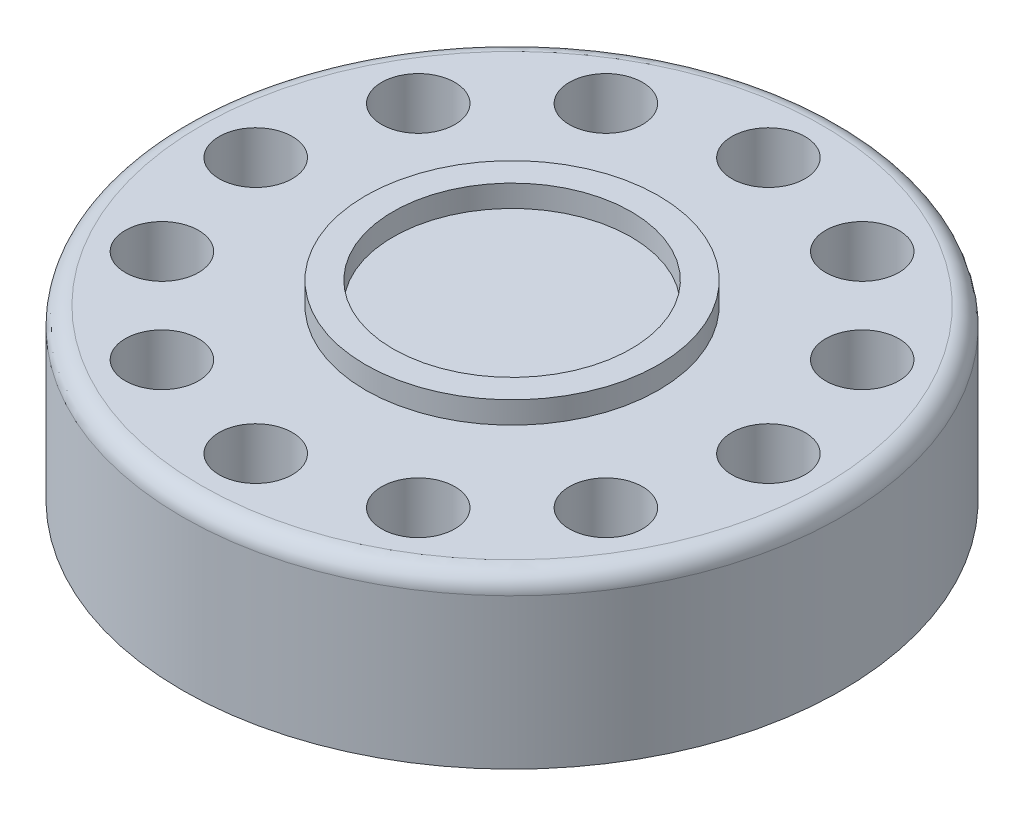
ISO-10303-21;
HEADER;
FILE_DESCRIPTION(('STEP AP214'),'2;1');
FILE_NAME('part.step','',(''),(''),'','','');
FILE_SCHEMA(('AUTOMOTIVE_DESIGN { 1 0 10303 214 1 1 1 1 }'));
ENDSEC;
DATA;
#1=APPLICATION_CONTEXT('core data for automotive mechanical design processes');
#2=APPLICATION_PROTOCOL_DEFINITION('international standard','automotive_design',2000,#1);
#3=PRODUCT_CONTEXT('',#1,'mechanical');
#4=PRODUCT('Part','Part','',(#3));
#5=PRODUCT_RELATED_PRODUCT_CATEGORY('part','',(#4));
#6=PRODUCT_DEFINITION_FORMATION('','',#4);
#7=PRODUCT_DEFINITION_CONTEXT('part definition',#1,'design');
#8=PRODUCT_DEFINITION('design','',#6,#7);
#9=PRODUCT_DEFINITION_SHAPE('','',#8);
#10=(LENGTH_UNIT() NAMED_UNIT(*) SI_UNIT(.MILLI.,.METRE.));
#11=(NAMED_UNIT(*) PLANE_ANGLE_UNIT() SI_UNIT($,.RADIAN.));
#12=(NAMED_UNIT(*) SI_UNIT($,.STERADIAN.) SOLID_ANGLE_UNIT());
#13=UNCERTAINTY_MEASURE_WITH_UNIT(LENGTH_MEASURE(1.E-05),#10,'distance_accuracy_value','');
#14=(GEOMETRIC_REPRESENTATION_CONTEXT(3) GLOBAL_UNCERTAINTY_ASSIGNED_CONTEXT((#13)) GLOBAL_UNIT_ASSIGNED_CONTEXT((#10,
#11,#12)) REPRESENTATION_CONTEXT('',''));
#15=CARTESIAN_POINT('',(0.,0.,0.));
#16=DIRECTION('',(0.,0.,1.));
#17=DIRECTION('',(1.,0.,0.));
#18=AXIS2_PLACEMENT_3D('',#15,#16,#17);
#19=CARTESIAN_POINT('',(0.,33.6,-12.8));
#20=DIRECTION('',(0.,1.,0.));
#21=DIRECTION('',(0.,0.,1.));
#22=AXIS2_PLACEMENT_3D('',#19,#20,#21);
#23=PLANE('',#22);
#24=CARTESIAN_POINT('',(0.,33.6,-12.8));
#25=DIRECTION('',(0.,1.,0.));
#26=DIRECTION('',(0.,0.,1.));
#27=AXIS2_PLACEMENT_3D('',#24,#25,#26);
#28=CIRCLE('',#27,4.);
#29=CARTESIAN_POINT('',(0.,33.6,-8.8));
#30=VERTEX_POINT('',#29);
#31=EDGE_CURVE('E60',#30,#30,#28,.T.);
#32=ORIENTED_EDGE('',*,*,#31,.F.);
#33=EDGE_LOOP('',(#32));
#34=FACE_BOUND('',#33,.T.);
#35=CARTESIAN_POINT('',(3.50000000000015,33.6,-18.8621778264916));
#36=DIRECTION('',(0.,1.,0.));
#37=DIRECTION('',(0.,0.,1.));
#38=AXIS2_PLACEMENT_3D('',#35,#36,#37);
#39=CIRCLE('',#38,1.);
#40=CARTESIAN_POINT('',(3.50000000000015,33.6,-17.8621778264916));
#41=VERTEX_POINT('',#40);
#42=EDGE_CURVE('E134',#41,#41,#39,.T.);
#43=ORIENTED_EDGE('',*,*,#42,.F.);
#44=EDGE_LOOP('',(#43));
#45=FACE_BOUND('',#44,.T.);
#46=CARTESIAN_POINT('',(6.06217782649163,33.6,-16.3000000000009));
#47=DIRECTION('',(0.,1.,0.));
#48=DIRECTION('',(0.,0.,1.));
#49=AXIS2_PLACEMENT_3D('',#46,#47,#48);
#50=CIRCLE('',#49,0.999999999999999);
#51=CARTESIAN_POINT('',(6.06217782649163,33.6,-15.3000000000009));
#52=VERTEX_POINT('',#51);
#53=EDGE_CURVE('E128',#52,#52,#50,.T.);
#54=ORIENTED_EDGE('',*,*,#53,.F.);
#55=EDGE_LOOP('',(#54));
#56=FACE_BOUND('',#55,.T.);
#57=CARTESIAN_POINT('',(7.00000000000109,33.6,-12.8000000000011));
#58=DIRECTION('',(0.,1.,0.));
#59=DIRECTION('',(0.,0.,1.));
#60=AXIS2_PLACEMENT_3D('',#57,#58,#59);
#61=CIRCLE('',#60,1.);
#62=CARTESIAN_POINT('',(7.00000000000109,33.6,-11.8000000000011));
#63=VERTEX_POINT('',#62);
#64=EDGE_CURVE('E122',#63,#63,#61,.T.);
#65=ORIENTED_EDGE('',*,*,#64,.F.);
#66=EDGE_LOOP('',(#65));
#67=FACE_BOUND('',#66,.T.);
#68=CARTESIAN_POINT('',(6.0621778264927,33.6,-9.30000000000092));
#69=DIRECTION('',(0.,1.,0.));
#70=DIRECTION('',(0.,0.,1.));
#71=AXIS2_PLACEMENT_3D('',#68,#69,#70);
#72=CIRCLE('',#71,1.);
#73=CARTESIAN_POINT('',(6.0621778264927,33.6,-8.30000000000092));
#74=VERTEX_POINT('',#73);
#75=EDGE_CURVE('E116',#74,#74,#72,.T.);
#76=ORIENTED_EDGE('',*,*,#75,.F.);
#77=EDGE_LOOP('',(#76));
#78=FACE_BOUND('',#77,.T.);
#79=CARTESIAN_POINT('',(3.500000000002,33.6,-6.73782217350945));
#80=DIRECTION('',(0.,1.,0.));
#81=DIRECTION('',(0.,0.,1.));
#82=AXIS2_PLACEMENT_3D('',#79,#80,#81);
#83=CIRCLE('',#82,0.999999999999999);
#84=CARTESIAN_POINT('',(3.500000000002,33.6,-5.73782217350945));
#85=VERTEX_POINT('',#84);
#86=EDGE_CURVE('E110',#85,#85,#83,.T.);
#87=ORIENTED_EDGE('',*,*,#86,.F.);
#88=EDGE_LOOP('',(#87));
#89=FACE_BOUND('',#88,.T.);
#90=CARTESIAN_POINT('',(2.1370191291191E-12,33.6,-5.8));
#91=DIRECTION('',(0.,1.,0.));
#92=DIRECTION('',(0.,0.,1.));
#93=AXIS2_PLACEMENT_3D('',#90,#91,#92);
#94=CIRCLE('',#93,1.);
#95=CARTESIAN_POINT('',(2.1370191291191E-12,33.6,-4.8));
#96=VERTEX_POINT('',#95);
#97=EDGE_CURVE('E104',#96,#96,#94,.T.);
#98=ORIENTED_EDGE('',*,*,#97,.F.);
#99=EDGE_LOOP('',(#98));
#100=FACE_BOUND('',#99,.T.);
#101=CARTESIAN_POINT('',(-3.49999999999801,33.6,-6.73782217350841));
#102=DIRECTION('',(0.,1.,0.));
#103=DIRECTION('',(0.,0.,1.));
#104=AXIS2_PLACEMENT_3D('',#101,#102,#103);
#105=CIRCLE('',#104,0.999999999999999);
#106=CARTESIAN_POINT('',(-3.49999999999801,33.6,-5.73782217350841));
#107=VERTEX_POINT('',#106);
#108=EDGE_CURVE('E98',#107,#107,#105,.T.);
#109=ORIENTED_EDGE('',*,*,#108,.F.);
#110=EDGE_LOOP('',(#109));
#111=FACE_BOUND('',#110,.T.);
#112=CARTESIAN_POINT('',(-6.06217782648946,33.6,-9.29999999999911));
#113=DIRECTION('',(0.,1.,0.));
#114=DIRECTION('',(0.,0.,1.));
#115=AXIS2_PLACEMENT_3D('',#112,#113,#114);
#116=CIRCLE('',#115,1.);
#117=CARTESIAN_POINT('',(-6.06217782648946,33.6,-8.29999999999911));
#118=VERTEX_POINT('',#117);
#119=EDGE_CURVE('E92',#118,#118,#116,.T.);
#120=ORIENTED_EDGE('',*,*,#119,.F.);
#121=EDGE_LOOP('',(#120));
#122=FACE_BOUND('',#121,.T.);
#123=CARTESIAN_POINT('',(-6.99999999999891,33.6,-12.799999999999));
#124=DIRECTION('',(0.,1.,0.));
#125=DIRECTION('',(0.,0.,1.));
#126=AXIS2_PLACEMENT_3D('',#123,#124,#125);
#127=CIRCLE('',#126,0.999999999999999);
#128=CARTESIAN_POINT('',(-6.99999999999891,33.6,-11.799999999999));
#129=VERTEX_POINT('',#128);
#130=EDGE_CURVE('E86',#129,#129,#127,.T.);
#131=ORIENTED_EDGE('',*,*,#130,.F.);
#132=EDGE_LOOP('',(#131));
#133=FACE_BOUND('',#132,.T.);
#134=CARTESIAN_POINT('',(-6.06217782649049,33.6,-16.2999999999991));
#135=DIRECTION('',(0.,1.,0.));
#136=DIRECTION('',(0.,0.,1.));
#137=AXIS2_PLACEMENT_3D('',#134,#135,#136);
#138=CIRCLE('',#137,0.999999999999998);
#139=CARTESIAN_POINT('',(-6.06217782649049,33.6,-15.2999999999991));
#140=VERTEX_POINT('',#139);
#141=EDGE_CURVE('E80',#140,#140,#138,.T.);
#142=ORIENTED_EDGE('',*,*,#141,.F.);
#143=EDGE_LOOP('',(#142));
#144=FACE_BOUND('',#143,.T.);
#145=CARTESIAN_POINT('',(-3.49999999999977,33.6,-18.8621778264906));
#146=DIRECTION('',(0.,1.,0.));
#147=DIRECTION('',(0.,0.,1.));
#148=AXIS2_PLACEMENT_3D('',#145,#146,#147);
#149=CIRCLE('',#148,1.);
#150=CARTESIAN_POINT('',(-3.49999999999977,33.6,-17.8621778264906));
#151=VERTEX_POINT('',#150);
#152=EDGE_CURVE('E74',#151,#151,#149,.T.);
#153=ORIENTED_EDGE('',*,*,#152,.F.);
#154=EDGE_LOOP('',(#153));
#155=FACE_BOUND('',#154,.T.);
#156=CARTESIAN_POINT('',(0.,33.6,-19.8));
#157=DIRECTION('',(0.,1.,0.));
#158=DIRECTION('',(0.,0.,1.));
#159=AXIS2_PLACEMENT_3D('',#156,#157,#158);
#160=CIRCLE('',#159,1.);
#161=CARTESIAN_POINT('',(0.,33.6,-18.8));
#162=VERTEX_POINT('',#161);
#163=EDGE_CURVE('E68',#162,#162,#160,.T.);
#164=ORIENTED_EDGE('',*,*,#163,.F.);
#165=EDGE_LOOP('',(#164));
#166=FACE_BOUND('',#165,.T.);
#167=CARTESIAN_POINT('',(0.,33.6,-12.8));
#168=DIRECTION('',(0.,1.,0.));
#169=DIRECTION('',(0.,0.,1.));
#170=AXIS2_PLACEMENT_3D('',#167,#168,#169);
#171=CIRCLE('',#170,8.5);
#172=CARTESIAN_POINT('',(0.,33.6,-4.3));
#173=VERTEX_POINT('',#172);
#174=EDGE_CURVE('E65',#173,#173,#171,.T.);
#175=ORIENTED_EDGE('',*,*,#174,.T.);
#176=EDGE_LOOP('',(#175));
#177=FACE_BOUND('',#176,.T.);
#178=ADVANCED_FACE('F47',(#34,#45,#56,#67,#78,#89,#100,#111,#122,#133,#144,#155,#166,#177),#23,.T.);
#179=CARTESIAN_POINT('',(0.,33.6,-12.8));
#180=DIRECTION('',(0.,-1.,0.));
#181=DIRECTION('',(0.,0.,-1.));
#182=AXIS2_PLACEMENT_3D('',#179,#180,#181);
#183=CYLINDRICAL_SURFACE('',#182,9.);
#184=CARTESIAN_POINT('',(0.,33.1,-12.8));
#185=DIRECTION('',(0.,1.,0.));
#186=DIRECTION('',(0.,0.,1.));
#187=AXIS2_PLACEMENT_3D('',#184,#185,#186);
#188=CIRCLE('',#187,9.);
#189=CARTESIAN_POINT('',(0.,33.1,-3.8));
#190=VERTEX_POINT('',#189);
#191=EDGE_CURVE('E62',#190,#190,#188,.F.);
#192=ORIENTED_EDGE('',*,*,#191,.T.);
#193=EDGE_LOOP('',(#192));
#194=FACE_BOUND('',#193,.T.);
#195=CARTESIAN_POINT('',(0.,29.,-12.8));
#196=DIRECTION('',(0.,1.,0.));
#197=DIRECTION('',(0.,0.,1.));
#198=AXIS2_PLACEMENT_3D('',#195,#196,#197);
#199=CIRCLE('',#198,9.);
#200=CARTESIAN_POINT('',(0.,29.,-3.8));
#201=VERTEX_POINT('',#200);
#202=EDGE_CURVE('E51',#201,#201,#199,.T.);
#203=ORIENTED_EDGE('',*,*,#202,.T.);
#204=EDGE_LOOP('',(#203));
#205=FACE_BOUND('',#204,.T.);
#206=ADVANCED_FACE('F157',(#194,#205),#183,.T.);
#207=CARTESIAN_POINT('',(0.,29.,0.));
#208=DIRECTION('',(0.,-1.,0.));
#209=DIRECTION('',(0.,0.,-1.));
#210=AXIS2_PLACEMENT_3D('',#207,#208,#209);
#211=PLANE('',#210);
#212=ORIENTED_EDGE('',*,*,#202,.F.);
#213=EDGE_LOOP('',(#212));
#214=FACE_BOUND('',#213,.T.);
#215=ADVANCED_FACE('F189',(#214),#211,.T.);
#216=CARTESIAN_POINT('',(0.,33.1,-12.8));
#217=DIRECTION('',(0.,1.,0.));
#218=DIRECTION('',(0.,0.,1.));
#219=AXIS2_PLACEMENT_3D('',#216,#217,#218);
#220=TOROIDAL_SURFACE('',#219,8.5,0.5);
#221=ORIENTED_EDGE('',*,*,#191,.F.);
#222=EDGE_LOOP('',(#221));
#223=FACE_BOUND('',#222,.T.);
#224=ORIENTED_EDGE('',*,*,#174,.F.);
#225=EDGE_LOOP('',(#224));
#226=FACE_BOUND('',#225,.T.);
#227=ADVANCED_FACE('F186',(#223,#226),#220,.T.);
#228=CARTESIAN_POINT('',(0.,30.1,-19.8));
#229=DIRECTION('',(0.,1.,0.));
#230=DIRECTION('',(0.,0.,1.));
#231=AXIS2_PLACEMENT_3D('',#228,#229,#230);
#232=CYLINDRICAL_SURFACE('',#231,1.);
#233=CARTESIAN_POINT('',(0.,30.1,-19.8));
#234=DIRECTION('',(0.,1.,0.));
#235=DIRECTION('',(0.,0.,1.));
#236=AXIS2_PLACEMENT_3D('',#233,#234,#235);
#237=CIRCLE('',#236,1.);
#238=CARTESIAN_POINT('',(0.,30.1,-18.8));
#239=VERTEX_POINT('',#238);
#240=EDGE_CURVE('E71',#239,#239,#237,.T.);
#241=ORIENTED_EDGE('',*,*,#240,.F.);
#242=EDGE_LOOP('',(#241));
#243=FACE_BOUND('',#242,.T.);
#244=ORIENTED_EDGE('',*,*,#163,.T.);
#245=EDGE_LOOP('',(#244));
#246=FACE_BOUND('',#245,.T.);
#247=ADVANCED_FACE('F188',(#243,#246),#232,.F.);
#248=CARTESIAN_POINT('',(0.,30.1,-19.8));
#249=DIRECTION('',(0.,1.,0.));
#250=DIRECTION('',(0.,0.,1.));
#251=AXIS2_PLACEMENT_3D('',#248,#249,#250);
#252=PLANE('',#251);
#253=ORIENTED_EDGE('',*,*,#240,.T.);
#254=EDGE_LOOP('',(#253));
#255=FACE_BOUND('',#254,.T.);
#256=ADVANCED_FACE('F197',(#255),#252,.T.);
#257=CARTESIAN_POINT('',(-3.49999999999977,30.1,-18.8621778264906));
#258=DIRECTION('',(0.,1.,0.));
#259=DIRECTION('',(0.,0.,1.));
#260=AXIS2_PLACEMENT_3D('',#257,#258,#259);
#261=CYLINDRICAL_SURFACE('',#260,1.);
#262=CARTESIAN_POINT('',(-3.49999999999977,30.1,-18.8621778264906));
#263=DIRECTION('',(0.,1.,0.));
#264=DIRECTION('',(0.,0.,1.));
#265=AXIS2_PLACEMENT_3D('',#262,#263,#264);
#266=CIRCLE('',#265,1.);
#267=CARTESIAN_POINT('',(-3.49999999999977,30.1,-17.8621778264906));
#268=VERTEX_POINT('',#267);
#269=EDGE_CURVE('E77',#268,#268,#266,.T.);
#270=ORIENTED_EDGE('',*,*,#269,.F.);
#271=EDGE_LOOP('',(#270));
#272=FACE_BOUND('',#271,.T.);
#273=ORIENTED_EDGE('',*,*,#152,.T.);
#274=EDGE_LOOP('',(#273));
#275=FACE_BOUND('',#274,.T.);
#276=ADVANCED_FACE('F209',(#272,#275),#261,.F.);
#277=CARTESIAN_POINT('',(-3.49999999999977,30.1,-18.8621778264906));
#278=DIRECTION('',(0.,1.,0.));
#279=DIRECTION('',(0.,0.,1.));
#280=AXIS2_PLACEMENT_3D('',#277,#278,#279);
#281=PLANE('',#280);
#282=ORIENTED_EDGE('',*,*,#269,.T.);
#283=EDGE_LOOP('',(#282));
#284=FACE_BOUND('',#283,.T.);
#285=ADVANCED_FACE('F213',(#284),#281,.T.);
#286=CARTESIAN_POINT('',(-6.06217782649049,30.1,-16.2999999999991));
#287=DIRECTION('',(0.,1.,0.));
#288=DIRECTION('',(0.,0.,1.));
#289=AXIS2_PLACEMENT_3D('',#286,#287,#288);
#290=CYLINDRICAL_SURFACE('',#289,0.999999999999998);
#291=CARTESIAN_POINT('',(-6.06217782649049,30.1,-16.2999999999991));
#292=DIRECTION('',(0.,1.,0.));
#293=DIRECTION('',(0.,0.,1.));
#294=AXIS2_PLACEMENT_3D('',#291,#292,#293);
#295=CIRCLE('',#294,0.999999999999998);
#296=CARTESIAN_POINT('',(-6.06217782649049,30.1,-15.2999999999991));
#297=VERTEX_POINT('',#296);
#298=EDGE_CURVE('E83',#297,#297,#295,.T.);
#299=ORIENTED_EDGE('',*,*,#298,.F.);
#300=EDGE_LOOP('',(#299));
#301=FACE_BOUND('',#300,.T.);
#302=ORIENTED_EDGE('',*,*,#141,.T.);
#303=EDGE_LOOP('',(#302));
#304=FACE_BOUND('',#303,.T.);
#305=ADVANCED_FACE('F217',(#301,#304),#290,.F.);
#306=CARTESIAN_POINT('',(-6.06217782649049,30.1,-16.2999999999991));
#307=DIRECTION('',(0.,1.,0.));
#308=DIRECTION('',(0.,0.,1.));
#309=AXIS2_PLACEMENT_3D('',#306,#307,#308);
#310=PLANE('',#309);
#311=ORIENTED_EDGE('',*,*,#298,.T.);
#312=EDGE_LOOP('',(#311));
#313=FACE_BOUND('',#312,.T.);
#314=ADVANCED_FACE('F221',(#313),#310,.T.);
#315=CARTESIAN_POINT('',(-6.99999999999891,30.1,-12.799999999999));
#316=DIRECTION('',(0.,1.,0.));
#317=DIRECTION('',(0.,0.,1.));
#318=AXIS2_PLACEMENT_3D('',#315,#316,#317);
#319=CYLINDRICAL_SURFACE('',#318,0.999999999999999);
#320=CARTESIAN_POINT('',(-6.99999999999891,30.1,-12.799999999999));
#321=DIRECTION('',(0.,1.,0.));
#322=DIRECTION('',(0.,0.,1.));
#323=AXIS2_PLACEMENT_3D('',#320,#321,#322);
#324=CIRCLE('',#323,0.999999999999999);
#325=CARTESIAN_POINT('',(-6.99999999999891,30.1,-11.799999999999));
#326=VERTEX_POINT('',#325);
#327=EDGE_CURVE('E89',#326,#326,#324,.T.);
#328=ORIENTED_EDGE('',*,*,#327,.F.);
#329=EDGE_LOOP('',(#328));
#330=FACE_BOUND('',#329,.T.);
#331=ORIENTED_EDGE('',*,*,#130,.T.);
#332=EDGE_LOOP('',(#331));
#333=FACE_BOUND('',#332,.T.);
#334=ADVANCED_FACE('F225',(#330,#333),#319,.F.);
#335=CARTESIAN_POINT('',(-6.99999999999891,30.1,-12.799999999999));
#336=DIRECTION('',(0.,1.,0.));
#337=DIRECTION('',(0.,0.,1.));
#338=AXIS2_PLACEMENT_3D('',#335,#336,#337);
#339=PLANE('',#338);
#340=ORIENTED_EDGE('',*,*,#327,.T.);
#341=EDGE_LOOP('',(#340));
#342=FACE_BOUND('',#341,.T.);
#343=ADVANCED_FACE('F229',(#342),#339,.T.);
#344=CARTESIAN_POINT('',(-6.06217782648946,30.1,-9.29999999999911));
#345=DIRECTION('',(0.,1.,0.));
#346=DIRECTION('',(0.,0.,1.));
#347=AXIS2_PLACEMENT_3D('',#344,#345,#346);
#348=CYLINDRICAL_SURFACE('',#347,1.);
#349=CARTESIAN_POINT('',(-6.06217782648946,30.1,-9.29999999999911));
#350=DIRECTION('',(0.,1.,0.));
#351=DIRECTION('',(0.,0.,1.));
#352=AXIS2_PLACEMENT_3D('',#349,#350,#351);
#353=CIRCLE('',#352,1.);
#354=CARTESIAN_POINT('',(-6.06217782648946,30.1,-8.29999999999911));
#355=VERTEX_POINT('',#354);
#356=EDGE_CURVE('E95',#355,#355,#353,.T.);
#357=ORIENTED_EDGE('',*,*,#356,.F.);
#358=EDGE_LOOP('',(#357));
#359=FACE_BOUND('',#358,.T.);
#360=ORIENTED_EDGE('',*,*,#119,.T.);
#361=EDGE_LOOP('',(#360));
#362=FACE_BOUND('',#361,.T.);
#363=ADVANCED_FACE('F233',(#359,#362),#348,.F.);
#364=CARTESIAN_POINT('',(-6.06217782648946,30.1,-9.29999999999911));
#365=DIRECTION('',(0.,1.,0.));
#366=DIRECTION('',(0.,0.,1.));
#367=AXIS2_PLACEMENT_3D('',#364,#365,#366);
#368=PLANE('',#367);
#369=ORIENTED_EDGE('',*,*,#356,.T.);
#370=EDGE_LOOP('',(#369));
#371=FACE_BOUND('',#370,.T.);
#372=ADVANCED_FACE('F237',(#371),#368,.T.);
#373=CARTESIAN_POINT('',(-3.49999999999801,30.1,-6.73782217350841));
#374=DIRECTION('',(0.,1.,0.));
#375=DIRECTION('',(0.,0.,1.));
#376=AXIS2_PLACEMENT_3D('',#373,#374,#375);
#377=CYLINDRICAL_SURFACE('',#376,0.999999999999999);
#378=CARTESIAN_POINT('',(-3.49999999999801,30.1,-6.73782217350841));
#379=DIRECTION('',(0.,1.,0.));
#380=DIRECTION('',(0.,0.,1.));
#381=AXIS2_PLACEMENT_3D('',#378,#379,#380);
#382=CIRCLE('',#381,0.999999999999999);
#383=CARTESIAN_POINT('',(-3.49999999999801,30.1,-5.73782217350841));
#384=VERTEX_POINT('',#383);
#385=EDGE_CURVE('E101',#384,#384,#382,.T.);
#386=ORIENTED_EDGE('',*,*,#385,.F.);
#387=EDGE_LOOP('',(#386));
#388=FACE_BOUND('',#387,.T.);
#389=ORIENTED_EDGE('',*,*,#108,.T.);
#390=EDGE_LOOP('',(#389));
#391=FACE_BOUND('',#390,.T.);
#392=ADVANCED_FACE('F241',(#388,#391),#377,.F.);
#393=CARTESIAN_POINT('',(-3.49999999999801,30.1,-6.73782217350841));
#394=DIRECTION('',(0.,1.,0.));
#395=DIRECTION('',(0.,0.,1.));
#396=AXIS2_PLACEMENT_3D('',#393,#394,#395);
#397=PLANE('',#396);
#398=ORIENTED_EDGE('',*,*,#385,.T.);
#399=EDGE_LOOP('',(#398));
#400=FACE_BOUND('',#399,.T.);
#401=ADVANCED_FACE('F245',(#400),#397,.T.);
#402=CARTESIAN_POINT('',(2.1370191291191E-12,30.1,-5.8));
#403=DIRECTION('',(0.,1.,0.));
#404=DIRECTION('',(0.,0.,1.));
#405=AXIS2_PLACEMENT_3D('',#402,#403,#404);
#406=CYLINDRICAL_SURFACE('',#405,1.);
#407=CARTESIAN_POINT('',(2.1370191291191E-12,30.1,-5.8));
#408=DIRECTION('',(0.,1.,0.));
#409=DIRECTION('',(0.,0.,1.));
#410=AXIS2_PLACEMENT_3D('',#407,#408,#409);
#411=CIRCLE('',#410,1.);
#412=CARTESIAN_POINT('',(2.1370191291191E-12,30.1,-4.8));
#413=VERTEX_POINT('',#412);
#414=EDGE_CURVE('E107',#413,#413,#411,.T.);
#415=ORIENTED_EDGE('',*,*,#414,.F.);
#416=EDGE_LOOP('',(#415));
#417=FACE_BOUND('',#416,.T.);
#418=ORIENTED_EDGE('',*,*,#97,.T.);
#419=EDGE_LOOP('',(#418));
#420=FACE_BOUND('',#419,.T.);
#421=ADVANCED_FACE('F249',(#417,#420),#406,.F.);
#422=CARTESIAN_POINT('',(2.1370191291191E-12,30.1,-5.8));
#423=DIRECTION('',(0.,1.,0.));
#424=DIRECTION('',(0.,0.,1.));
#425=AXIS2_PLACEMENT_3D('',#422,#423,#424);
#426=PLANE('',#425);
#427=ORIENTED_EDGE('',*,*,#414,.T.);
#428=EDGE_LOOP('',(#427));
#429=FACE_BOUND('',#428,.T.);
#430=ADVANCED_FACE('F253',(#429),#426,.T.);
#431=CARTESIAN_POINT('',(3.500000000002,30.1,-6.73782217350945));
#432=DIRECTION('',(0.,1.,0.));
#433=DIRECTION('',(0.,0.,1.));
#434=AXIS2_PLACEMENT_3D('',#431,#432,#433);
#435=CYLINDRICAL_SURFACE('',#434,0.999999999999999);
#436=CARTESIAN_POINT('',(3.500000000002,30.1,-6.73782217350945));
#437=DIRECTION('',(0.,1.,0.));
#438=DIRECTION('',(0.,0.,1.));
#439=AXIS2_PLACEMENT_3D('',#436,#437,#438);
#440=CIRCLE('',#439,0.999999999999999);
#441=CARTESIAN_POINT('',(3.500000000002,30.1,-5.73782217350945));
#442=VERTEX_POINT('',#441);
#443=EDGE_CURVE('E113',#442,#442,#440,.T.);
#444=ORIENTED_EDGE('',*,*,#443,.F.);
#445=EDGE_LOOP('',(#444));
#446=FACE_BOUND('',#445,.T.);
#447=ORIENTED_EDGE('',*,*,#86,.T.);
#448=EDGE_LOOP('',(#447));
#449=FACE_BOUND('',#448,.T.);
#450=ADVANCED_FACE('F257',(#446,#449),#435,.F.);
#451=CARTESIAN_POINT('',(3.500000000002,30.1,-6.73782217350945));
#452=DIRECTION('',(0.,1.,0.));
#453=DIRECTION('',(0.,0.,1.));
#454=AXIS2_PLACEMENT_3D('',#451,#452,#453);
#455=PLANE('',#454);
#456=ORIENTED_EDGE('',*,*,#443,.T.);
#457=EDGE_LOOP('',(#456));
#458=FACE_BOUND('',#457,.T.);
#459=ADVANCED_FACE('F261',(#458),#455,.T.);
#460=CARTESIAN_POINT('',(6.0621778264927,30.1,-9.30000000000092));
#461=DIRECTION('',(0.,1.,0.));
#462=DIRECTION('',(0.,0.,1.));
#463=AXIS2_PLACEMENT_3D('',#460,#461,#462);
#464=CYLINDRICAL_SURFACE('',#463,1.);
#465=CARTESIAN_POINT('',(6.0621778264927,30.1,-9.30000000000092));
#466=DIRECTION('',(0.,1.,0.));
#467=DIRECTION('',(0.,0.,1.));
#468=AXIS2_PLACEMENT_3D('',#465,#466,#467);
#469=CIRCLE('',#468,1.);
#470=CARTESIAN_POINT('',(6.0621778264927,30.1,-8.30000000000092));
#471=VERTEX_POINT('',#470);
#472=EDGE_CURVE('E119',#471,#471,#469,.T.);
#473=ORIENTED_EDGE('',*,*,#472,.F.);
#474=EDGE_LOOP('',(#473));
#475=FACE_BOUND('',#474,.T.);
#476=ORIENTED_EDGE('',*,*,#75,.T.);
#477=EDGE_LOOP('',(#476));
#478=FACE_BOUND('',#477,.T.);
#479=ADVANCED_FACE('F265',(#475,#478),#464,.F.);
#480=CARTESIAN_POINT('',(6.0621778264927,30.1,-9.30000000000092));
#481=DIRECTION('',(0.,1.,0.));
#482=DIRECTION('',(0.,0.,1.));
#483=AXIS2_PLACEMENT_3D('',#480,#481,#482);
#484=PLANE('',#483);
#485=ORIENTED_EDGE('',*,*,#472,.T.);
#486=EDGE_LOOP('',(#485));
#487=FACE_BOUND('',#486,.T.);
#488=ADVANCED_FACE('F269',(#487),#484,.T.);
#489=CARTESIAN_POINT('',(7.00000000000109,30.1,-12.8000000000011));
#490=DIRECTION('',(0.,1.,0.));
#491=DIRECTION('',(0.,0.,1.));
#492=AXIS2_PLACEMENT_3D('',#489,#490,#491);
#493=CYLINDRICAL_SURFACE('',#492,1.);
#494=CARTESIAN_POINT('',(7.00000000000109,30.1,-12.8000000000011));
#495=DIRECTION('',(0.,1.,0.));
#496=DIRECTION('',(0.,0.,1.));
#497=AXIS2_PLACEMENT_3D('',#494,#495,#496);
#498=CIRCLE('',#497,1.);
#499=CARTESIAN_POINT('',(7.00000000000109,30.1,-11.8000000000011));
#500=VERTEX_POINT('',#499);
#501=EDGE_CURVE('E125',#500,#500,#498,.T.);
#502=ORIENTED_EDGE('',*,*,#501,.F.);
#503=EDGE_LOOP('',(#502));
#504=FACE_BOUND('',#503,.T.);
#505=ORIENTED_EDGE('',*,*,#64,.T.);
#506=EDGE_LOOP('',(#505));
#507=FACE_BOUND('',#506,.T.);
#508=ADVANCED_FACE('F273',(#504,#507),#493,.F.);
#509=CARTESIAN_POINT('',(7.00000000000109,30.1,-12.8000000000011));
#510=DIRECTION('',(0.,1.,0.));
#511=DIRECTION('',(0.,0.,1.));
#512=AXIS2_PLACEMENT_3D('',#509,#510,#511);
#513=PLANE('',#512);
#514=ORIENTED_EDGE('',*,*,#501,.T.);
#515=EDGE_LOOP('',(#514));
#516=FACE_BOUND('',#515,.T.);
#517=ADVANCED_FACE('F277',(#516),#513,.T.);
#518=CARTESIAN_POINT('',(6.06217782649163,30.1,-16.3000000000009));
#519=DIRECTION('',(0.,1.,0.));
#520=DIRECTION('',(0.,0.,1.));
#521=AXIS2_PLACEMENT_3D('',#518,#519,#520);
#522=CYLINDRICAL_SURFACE('',#521,0.999999999999999);
#523=CARTESIAN_POINT('',(6.06217782649163,30.1,-16.3000000000009));
#524=DIRECTION('',(0.,1.,0.));
#525=DIRECTION('',(0.,0.,1.));
#526=AXIS2_PLACEMENT_3D('',#523,#524,#525);
#527=CIRCLE('',#526,0.999999999999999);
#528=CARTESIAN_POINT('',(6.06217782649163,30.1,-15.3000000000009));
#529=VERTEX_POINT('',#528);
#530=EDGE_CURVE('E131',#529,#529,#527,.T.);
#531=ORIENTED_EDGE('',*,*,#530,.F.);
#532=EDGE_LOOP('',(#531));
#533=FACE_BOUND('',#532,.T.);
#534=ORIENTED_EDGE('',*,*,#53,.T.);
#535=EDGE_LOOP('',(#534));
#536=FACE_BOUND('',#535,.T.);
#537=ADVANCED_FACE('F281',(#533,#536),#522,.F.);
#538=CARTESIAN_POINT('',(6.06217782649163,30.1,-16.3000000000009));
#539=DIRECTION('',(0.,1.,0.));
#540=DIRECTION('',(0.,0.,1.));
#541=AXIS2_PLACEMENT_3D('',#538,#539,#540);
#542=PLANE('',#541);
#543=ORIENTED_EDGE('',*,*,#530,.T.);
#544=EDGE_LOOP('',(#543));
#545=FACE_BOUND('',#544,.T.);
#546=ADVANCED_FACE('F285',(#545),#542,.T.);
#547=CARTESIAN_POINT('',(3.50000000000015,30.1,-18.8621778264916));
#548=DIRECTION('',(0.,1.,0.));
#549=DIRECTION('',(0.,0.,1.));
#550=AXIS2_PLACEMENT_3D('',#547,#548,#549);
#551=CYLINDRICAL_SURFACE('',#550,1.);
#552=CARTESIAN_POINT('',(3.50000000000015,30.1,-18.8621778264916));
#553=DIRECTION('',(0.,1.,0.));
#554=DIRECTION('',(0.,0.,1.));
#555=AXIS2_PLACEMENT_3D('',#552,#553,#554);
#556=CIRCLE('',#555,1.);
#557=CARTESIAN_POINT('',(3.50000000000015,30.1,-17.8621778264916));
#558=VERTEX_POINT('',#557);
#559=EDGE_CURVE('E137',#558,#558,#556,.T.);
#560=ORIENTED_EDGE('',*,*,#559,.F.);
#561=EDGE_LOOP('',(#560));
#562=FACE_BOUND('',#561,.T.);
#563=ORIENTED_EDGE('',*,*,#42,.T.);
#564=EDGE_LOOP('',(#563));
#565=FACE_BOUND('',#564,.T.);
#566=ADVANCED_FACE('F289',(#562,#565),#551,.F.);
#567=CARTESIAN_POINT('',(3.50000000000015,30.1,-18.8621778264916));
#568=DIRECTION('',(0.,1.,0.));
#569=DIRECTION('',(0.,0.,1.));
#570=AXIS2_PLACEMENT_3D('',#567,#568,#569);
#571=PLANE('',#570);
#572=ORIENTED_EDGE('',*,*,#559,.T.);
#573=EDGE_LOOP('',(#572));
#574=FACE_BOUND('',#573,.T.);
#575=ADVANCED_FACE('F293',(#574),#571,.T.);
#576=CARTESIAN_POINT('',(0.,34.2,-12.8));
#577=DIRECTION('',(0.,1.,0.));
#578=DIRECTION('',(0.,0.,1.));
#579=AXIS2_PLACEMENT_3D('',#576,#577,#578);
#580=PLANE('',#579);
#581=CARTESIAN_POINT('',(0.,34.2,-12.8));
#582=DIRECTION('',(0.,1.,0.));
#583=DIRECTION('',(0.,0.,1.));
#584=AXIS2_PLACEMENT_3D('',#581,#582,#583);
#585=CIRCLE('',#584,4.);
#586=CARTESIAN_POINT('',(0.,34.2,-8.8));
#587=VERTEX_POINT('',#586);
#588=EDGE_CURVE('E140',#587,#587,#585,.T.);
#589=ORIENTED_EDGE('',*,*,#588,.T.);
#590=EDGE_LOOP('',(#589));
#591=FACE_BOUND('',#590,.T.);
#592=CARTESIAN_POINT('',(0.,34.2,-12.8));
#593=DIRECTION('',(0.,1.,0.));
#594=DIRECTION('',(0.,0.,1.));
#595=AXIS2_PLACEMENT_3D('',#592,#593,#594);
#596=CIRCLE('',#595,3.25);
#597=CARTESIAN_POINT('',(0.,34.2,-9.55));
#598=VERTEX_POINT('',#597);
#599=EDGE_CURVE('E55',#598,#598,#596,.T.);
#600=ORIENTED_EDGE('',*,*,#599,.F.);
#601=EDGE_LOOP('',(#600));
#602=FACE_BOUND('',#601,.T.);
#603=ADVANCED_FACE('F146',(#591,#602),#580,.T.);
#604=CARTESIAN_POINT('',(0.,34.2,-12.8));
#605=DIRECTION('',(0.,-1.,0.));
#606=DIRECTION('',(0.,0.,-1.));
#607=AXIS2_PLACEMENT_3D('',#604,#605,#606);
#608=CYLINDRICAL_SURFACE('',#607,4.);
#609=ORIENTED_EDGE('',*,*,#588,.F.);
#610=EDGE_LOOP('',(#609));
#611=FACE_BOUND('',#610,.T.);
#612=ORIENTED_EDGE('',*,*,#31,.T.);
#613=EDGE_LOOP('',(#612));
#614=FACE_BOUND('',#613,.T.);
#615=ADVANCED_FACE('F149',(#611,#614),#608,.T.);
#616=CARTESIAN_POINT('',(0.,34.2,-12.8));
#617=DIRECTION('',(0.,-1.,0.));
#618=DIRECTION('',(0.,0.,-1.));
#619=AXIS2_PLACEMENT_3D('',#616,#617,#618);
#620=CYLINDRICAL_SURFACE('',#619,3.25);
#621=ORIENTED_EDGE('',*,*,#599,.T.);
#622=EDGE_LOOP('',(#621));
#623=FACE_BOUND('',#622,.T.);
#624=CARTESIAN_POINT('',(0.,33.6,-12.8));
#625=DIRECTION('',(0.,1.,0.));
#626=DIRECTION('',(0.,0.,1.));
#627=AXIS2_PLACEMENT_3D('',#624,#625,#626);
#628=CIRCLE('',#627,3.25);
#629=CARTESIAN_POINT('',(0.,33.6,-9.55));
#630=VERTEX_POINT('',#629);
#631=EDGE_CURVE('E10',#630,#630,#628,.F.);
#632=ORIENTED_EDGE('',*,*,#631,.T.);
#633=EDGE_LOOP('',(#632));
#634=FACE_BOUND('',#633,.T.);
#635=ADVANCED_FACE('F49',(#623,#634),#620,.F.);
#636=ORIENTED_EDGE('',*,*,#631,.F.);
#637=EDGE_LOOP('',(#636));
#638=FACE_BOUND('',#637,.T.);
#639=ADVANCED_FACE('F159',(#638),#23,.T.);
#640=CLOSED_SHELL('',(#178,#206,#215,#227,#247,#256,#276,#285,#305,#314,#334,#343,#363,#372,
#392,#401,#421,#430,#450,#459,#479,#488,#508,#517,#537,#546,#566,#575,#603,#615,#635,#639));
#641=MANIFOLD_SOLID_BREP('B2',#640);
#642=ADVANCED_BREP_SHAPE_REPRESENTATION('',(#18,#641),#14);
#643=SHAPE_DEFINITION_REPRESENTATION(#9,#642);
ENDSEC;
END-ISO-10303-21;
